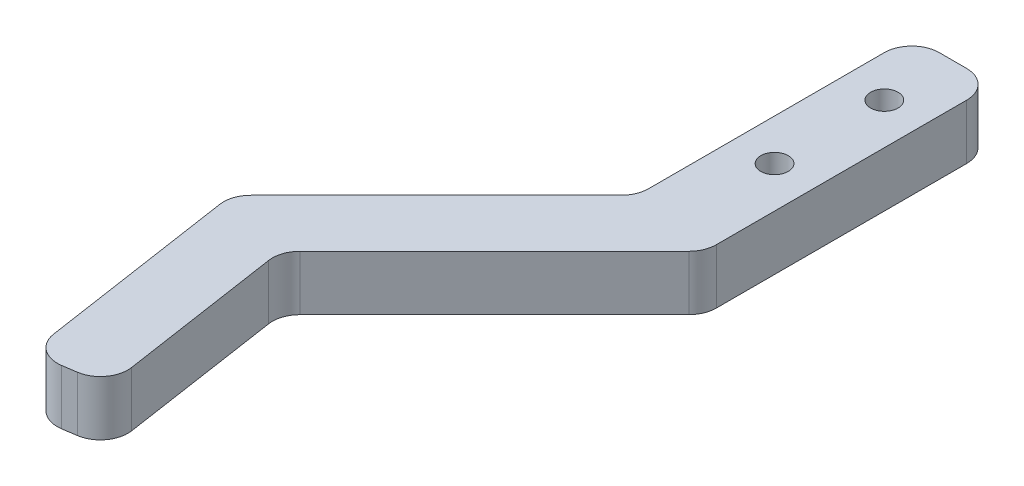
ISO-10303-21;
HEADER;
FILE_DESCRIPTION(('STEP AP214'),'2;1');
FILE_NAME('part.step','',(''),(''),'','','');
FILE_SCHEMA(('AUTOMOTIVE_DESIGN { 1 0 10303 214 1 1 1 1 }'));
ENDSEC;
DATA;
#1=APPLICATION_CONTEXT('core data for automotive mechanical design processes');
#2=APPLICATION_PROTOCOL_DEFINITION('international standard','automotive_design',2000,#1);
#3=PRODUCT_CONTEXT('',#1,'mechanical');
#4=PRODUCT('Part','Part','',(#3));
#5=PRODUCT_RELATED_PRODUCT_CATEGORY('part','',(#4));
#6=PRODUCT_DEFINITION_FORMATION('','',#4);
#7=PRODUCT_DEFINITION_CONTEXT('part definition',#1,'design');
#8=PRODUCT_DEFINITION('design','',#6,#7);
#9=PRODUCT_DEFINITION_SHAPE('','',#8);
#10=(LENGTH_UNIT() NAMED_UNIT(*) SI_UNIT(.MILLI.,.METRE.));
#11=(NAMED_UNIT(*) PLANE_ANGLE_UNIT() SI_UNIT($,.RADIAN.));
#12=(NAMED_UNIT(*) SI_UNIT($,.STERADIAN.) SOLID_ANGLE_UNIT());
#13=UNCERTAINTY_MEASURE_WITH_UNIT(LENGTH_MEASURE(1.E-05),#10,'distance_accuracy_value','');
#14=(GEOMETRIC_REPRESENTATION_CONTEXT(3) GLOBAL_UNCERTAINTY_ASSIGNED_CONTEXT((#13)) GLOBAL_UNIT_ASSIGNED_CONTEXT((#10,
#11,#12)) REPRESENTATION_CONTEXT('',''));
#15=CARTESIAN_POINT('',(0.,0.,0.));
#16=DIRECTION('',(0.,0.,1.));
#17=DIRECTION('',(1.,0.,0.));
#18=AXIS2_PLACEMENT_3D('',#15,#16,#17);
#19=CARTESIAN_POINT('',(-1.51540342298289,4.,-10.1026894865526));
#20=DIRECTION('',(0.148340452930245,0.,0.988936352868298));
#21=DIRECTION('',(0.988936352868298,0.,-0.148340452930245));
#22=AXIS2_PLACEMENT_3D('',#19,#20,#21);
#23=PLANE('',#22);
#24=DIRECTION('',(-0.988936352868298,0.,0.148340452930245));
#25=VECTOR('',#24,1.);
#26=CARTESIAN_POINT('',(-1.51540342298289,0.,-10.1026894865526));
#27=LINE('',#26,#25);
#28=CARTESIAN_POINT('',(20.7668090586049,0.,-13.4450213587907));
#29=VERTEX_POINT('',#28);
#30=CARTESIAN_POINT('',(19.7778727057366,0.,-13.2966809058605));
#31=VERTEX_POINT('',#30);
#32=EDGE_CURVE('E252',#29,#31,#27,.T.);
#33=ORIENTED_EDGE('',*,*,#32,.F.);
#34=DIRECTION('',(0.,-1.,0.));
#35=VECTOR('',#34,1.);
#36=CARTESIAN_POINT('',(20.7668090586049,4.,-13.4450213587907));
#37=LINE('',#36,#35);
#38=CARTESIAN_POINT('',(20.7668090586049,4.,-13.4450213587907));
#39=VERTEX_POINT('',#38);
#40=EDGE_CURVE('E230',#29,#39,#37,.F.);
#41=ORIENTED_EDGE('',*,*,#40,.T.);
#42=DIRECTION('',(-0.988936352868298,0.,0.148340452930245));
#43=VECTOR('',#42,1.);
#44=CARTESIAN_POINT('',(-1.51540342298289,4.,-10.1026894865526));
#45=LINE('',#44,#43);
#46=CARTESIAN_POINT('',(19.7778727057366,4.,-13.2966809058605));
#47=VERTEX_POINT('',#46);
#48=EDGE_CURVE('E270',#39,#47,#45,.T.);
#49=ORIENTED_EDGE('',*,*,#48,.T.);
#50=DIRECTION('',(0.,-1.,0.));
#51=VECTOR('',#50,1.);
#52=CARTESIAN_POINT('',(19.7778727057366,0.,-13.2966809058605));
#53=LINE('',#52,#51);
#54=EDGE_CURVE('E227',#47,#31,#53,.T.);
#55=ORIENTED_EDGE('',*,*,#54,.T.);
#56=EDGE_LOOP('',(#33,#41,#49,#55));
#57=FACE_BOUND('',#56,.T.);
#58=ADVANCED_FACE('F40',(#57),#23,.T.);
#59=CARTESIAN_POINT('',(24.2600851873244,4.,-3.63901277809867));
#60=DIRECTION('',(0.988936352868298,0.,-0.148340452930245));
#61=DIRECTION('',(-0.148340452930245,0.,-0.988936352868298));
#62=AXIS2_PLACEMENT_3D('',#59,#60,#61);
#63=PLANE('',#62);
#64=DIRECTION('',(0.148340452930245,0.,0.988936352868298));
#65=VECTOR('',#64,1.);
#66=CARTESIAN_POINT('',(24.2600851873244,4.,-3.63901277809867));
#67=LINE('',#66,#65);
#68=CARTESIAN_POINT('',(20.6858109343909,4.,-27.4675077976549));
#69=VERTEX_POINT('',#68);
#70=CARTESIAN_POINT('',(22.448000858481,4.,-15.7195749703878));
#71=VERTEX_POINT('',#70);
#72=EDGE_CURVE('E261',#69,#71,#67,.T.);
#73=ORIENTED_EDGE('',*,*,#72,.T.);
#74=DIRECTION('',(0.,-1.,0.));
#75=VECTOR('',#74,1.);
#76=CARTESIAN_POINT('',(22.448000858481,4.,-15.7195749703878));
#77=LINE('',#76,#75);
#78=CARTESIAN_POINT('',(22.448000858481,0.,-15.7195749703878));
#79=VERTEX_POINT('',#78);
#80=EDGE_CURVE('E224',#71,#79,#77,.T.);
#81=ORIENTED_EDGE('',*,*,#80,.T.);
#82=DIRECTION('',(0.148340452930245,0.,0.988936352868298));
#83=VECTOR('',#82,1.);
#84=CARTESIAN_POINT('',(24.2600851873244,0.,-3.63901277809867));
#85=LINE('',#84,#83);
#86=CARTESIAN_POINT('',(20.6858109343909,0.,-27.4675077976549));
#87=VERTEX_POINT('',#86);
#88=EDGE_CURVE('E241',#87,#79,#85,.T.);
#89=ORIENTED_EDGE('',*,*,#88,.F.);
#90=DIRECTION('',(0.,-1.,0.));
#91=VECTOR('',#90,1.);
#92=CARTESIAN_POINT('',(20.6858109343909,4.,-27.4675077976549));
#93=LINE('',#92,#91);
#94=EDGE_CURVE('E222',#87,#69,#93,.F.);
#95=ORIENTED_EDGE('',*,*,#94,.T.);
#96=EDGE_LOOP('',(#73,#81,#89,#95));
#97=FACE_BOUND('',#96,.T.);
#98=ADVANCED_FACE('F249',(#97),#63,.T.);
#99=CARTESIAN_POINT('',(-3.96446609406635,4.,-3.9644660940661));
#100=DIRECTION('',(0.70710678118657,0.,0.707106781186525));
#101=DIRECTION('',(0.707106781186525,0.,-0.70710678118657));
#102=AXIS2_PLACEMENT_3D('',#99,#100,#101);
#103=PLANE('',#102);
#104=DIRECTION('',(-0.707106781186525,0.,0.70710678118657));
#105=VECTOR('',#104,1.);
#106=CARTESIAN_POINT('',(-3.96446609406635,0.,-3.9644660940661));
#107=LINE('',#106,#105);
#108=CARTESIAN_POINT('',(35.4142135623728,0.,-43.3431457505078));
#109=VERTEX_POINT('',#108);
#110=CARTESIAN_POINT('',(21.2494700777544,0.,-29.1784022658884));
#111=VERTEX_POINT('',#110);
#112=EDGE_CURVE('E243',#109,#111,#107,.T.);
#113=ORIENTED_EDGE('',*,*,#112,.F.);
#114=DIRECTION('',(0.,-1.,0.));
#115=VECTOR('',#114,1.);
#116=CARTESIAN_POINT('',(35.4142135623728,4.,-43.3431457505078));
#117=LINE('',#116,#115);
#118=CARTESIAN_POINT('',(35.4142135623728,4.,-43.3431457505078));
#119=VERTEX_POINT('',#118);
#120=EDGE_CURVE('E204',#109,#119,#117,.F.);
#121=ORIENTED_EDGE('',*,*,#120,.T.);
#122=DIRECTION('',(-0.707106781186525,0.,0.70710678118657));
#123=VECTOR('',#122,1.);
#124=CARTESIAN_POINT('',(-3.96446609406635,4.,-3.9644660940661));
#125=LINE('',#124,#123);
#126=CARTESIAN_POINT('',(21.2494700777544,4.,-29.1784022658884));
#127=VERTEX_POINT('',#126);
#128=EDGE_CURVE('E259',#119,#127,#125,.T.);
#129=ORIENTED_EDGE('',*,*,#128,.T.);
#130=DIRECTION('',(0.,-1.,0.));
#131=VECTOR('',#130,1.);
#132=CARTESIAN_POINT('',(21.2494700777544,0.,-29.1784022658884));
#133=LINE('',#132,#131);
#134=EDGE_CURVE('E201',#127,#111,#133,.T.);
#135=ORIENTED_EDGE('',*,*,#134,.T.);
#136=EDGE_LOOP('',(#113,#121,#129,#135));
#137=FACE_BOUND('',#136,.T.);
#138=ADVANCED_FACE('F263',(#137),#103,.T.);
#139=CARTESIAN_POINT('',(35.9999999999987,4.,8.18003748609221E-13));
#140=DIRECTION('',(1.,0.,0.));
#141=DIRECTION('',(0.,0.,-1.));
#142=AXIS2_PLACEMENT_3D('',#139,#140,#141);
#143=PLANE('',#142);
#144=DIRECTION('',(0.,0.,1.));
#145=VECTOR('',#144,1.);
#146=CARTESIAN_POINT('',(35.9999999999987,4.,8.18003748609221E-13));
#147=LINE('',#146,#145);
#148=CARTESIAN_POINT('',(36.0000000000001,4.,-62.9999999999999));
#149=VERTEX_POINT('',#148);
#150=CARTESIAN_POINT('',(35.9999999999997,4.,-44.7573593128808));
#151=VERTEX_POINT('',#150);
#152=EDGE_CURVE('E265',#149,#151,#147,.T.);
#153=ORIENTED_EDGE('',*,*,#152,.T.);
#154=DIRECTION('',(0.,-1.,0.));
#155=VECTOR('',#154,1.);
#156=CARTESIAN_POINT('',(35.9999999999997,4.,-44.7573593128808));
#157=LINE('',#156,#155);
#158=CARTESIAN_POINT('',(35.9999999999997,0.,-44.7573593128808));
#159=VERTEX_POINT('',#158);
#160=EDGE_CURVE('E165',#151,#159,#157,.T.);
#161=ORIENTED_EDGE('',*,*,#160,.T.);
#162=DIRECTION('',(0.,0.,1.));
#163=VECTOR('',#162,1.);
#164=CARTESIAN_POINT('',(35.9999999999987,0.,8.18003748609221E-13));
#165=LINE('',#164,#163);
#166=CARTESIAN_POINT('',(36.0000000000001,0.,-62.9999999999999));
#167=VERTEX_POINT('',#166);
#168=EDGE_CURVE('E289',#167,#159,#165,.T.);
#169=ORIENTED_EDGE('',*,*,#168,.F.);
#170=DIRECTION('',(0.,-1.,0.));
#171=VECTOR('',#170,1.);
#172=CARTESIAN_POINT('',(36.0000000000001,4.,-62.9999999999999));
#173=LINE('',#172,#171);
#174=EDGE_CURVE('E188',#167,#149,#173,.F.);
#175=ORIENTED_EDGE('',*,*,#174,.T.);
#176=EDGE_LOOP('',(#153,#161,#169,#175));
#177=FACE_BOUND('',#176,.T.);
#178=ADVANCED_FACE('F320',(#177),#143,.T.);
#179=CARTESIAN_POINT('',(6.01370805005278E-13,4.,-65.0000000000003));
#180=DIRECTION('',(0.,0.,-1.));
#181=DIRECTION('',(-1.,0.,0.));
#182=AXIS2_PLACEMENT_3D('',#179,#180,#181);
#183=PLANE('',#182);
#184=DIRECTION('',(1.,0.,0.));
#185=VECTOR('',#184,1.);
#186=CARTESIAN_POINT('',(6.01370805005278E-13,4.,-65.0000000000003));
#187=LINE('',#186,#185);
#188=CARTESIAN_POINT('',(32.,4.,-65.));
#189=VERTEX_POINT('',#188);
#190=CARTESIAN_POINT('',(34.0000000000001,4.,-65.));
#191=VERTEX_POINT('',#190);
#192=EDGE_CURVE('E268',#189,#191,#187,.T.);
#193=ORIENTED_EDGE('',*,*,#192,.T.);
#194=DIRECTION('',(0.,-1.,0.));
#195=VECTOR('',#194,1.);
#196=CARTESIAN_POINT('',(34.0000000000001,4.,-65.));
#197=LINE('',#196,#195);
#198=CARTESIAN_POINT('',(34.0000000000001,0.,-65.));
#199=VERTEX_POINT('',#198);
#200=EDGE_CURVE('E219',#191,#199,#197,.T.);
#201=ORIENTED_EDGE('',*,*,#200,.T.);
#202=DIRECTION('',(1.,0.,0.));
#203=VECTOR('',#202,1.);
#204=CARTESIAN_POINT('',(6.01370805005278E-13,0.,-65.0000000000003));
#205=LINE('',#204,#203);
#206=CARTESIAN_POINT('',(32.,0.,-65.));
#207=VERTEX_POINT('',#206);
#208=EDGE_CURVE('E291',#207,#199,#205,.T.);
#209=ORIENTED_EDGE('',*,*,#208,.F.);
#210=DIRECTION('',(0.,-1.,0.));
#211=VECTOR('',#210,1.);
#212=CARTESIAN_POINT('',(32.,4.,-65.));
#213=LINE('',#212,#211);
#214=EDGE_CURVE('E217',#207,#189,#213,.F.);
#215=ORIENTED_EDGE('',*,*,#214,.T.);
#216=EDGE_LOOP('',(#193,#201,#209,#215));
#217=FACE_BOUND('',#216,.T.);
#218=ADVANCED_FACE('F311',(#217),#183,.T.);
#219=CARTESIAN_POINT('',(29.9999999999996,4.,1.92554305833423E-13));
#220=DIRECTION('',(-1.,0.,0.));
#221=DIRECTION('',(0.,0.,1.));
#222=AXIS2_PLACEMENT_3D('',#219,#220,#221);
#223=PLANE('',#222);
#224=DIRECTION('',(0.,0.,-1.));
#225=VECTOR('',#224,1.);
#226=CARTESIAN_POINT('',(29.9999999999996,0.,1.92554305833423E-13));
#227=LINE('',#226,#225);
#228=CARTESIAN_POINT('',(29.9999999999999,0.,-45.8284271247462));
#229=VERTEX_POINT('',#228);
#230=CARTESIAN_POINT('',(30.,0.,-63.));
#231=VERTEX_POINT('',#230);
#232=EDGE_CURVE('E174',#229,#231,#227,.T.);
#233=ORIENTED_EDGE('',*,*,#232,.F.);
#234=DIRECTION('',(0.,-1.,0.));
#235=VECTOR('',#234,1.);
#236=CARTESIAN_POINT('',(29.9999999999999,4.,-45.8284271247462));
#237=LINE('',#236,#235);
#238=CARTESIAN_POINT('',(29.9999999999999,4.,-45.8284271247462));
#239=VERTEX_POINT('',#238);
#240=EDGE_CURVE('E186',#229,#239,#237,.F.);
#241=ORIENTED_EDGE('',*,*,#240,.T.);
#242=DIRECTION('',(0.,0.,-1.));
#243=VECTOR('',#242,1.);
#244=CARTESIAN_POINT('',(29.9999999999996,4.,1.92554305833423E-13));
#245=LINE('',#244,#243);
#246=CARTESIAN_POINT('',(30.,4.,-63.));
#247=VERTEX_POINT('',#246);
#248=EDGE_CURVE('E276',#239,#247,#245,.T.);
#249=ORIENTED_EDGE('',*,*,#248,.T.);
#250=DIRECTION('',(0.,-1.,0.));
#251=VECTOR('',#250,1.);
#252=CARTESIAN_POINT('',(30.,4.,-63.));
#253=LINE('',#252,#251);
#254=EDGE_CURVE('E178',#247,#231,#253,.T.);
#255=ORIENTED_EDGE('',*,*,#254,.T.);
#256=EDGE_LOOP('',(#233,#241,#249,#255));
#257=FACE_BOUND('',#256,.T.);
#258=ADVANCED_FACE('F299',(#257),#223,.T.);
#259=CARTESIAN_POINT('',(-7.49999999999961,4.,-7.49999999999937));
#260=DIRECTION('',(-0.707106781186559,0.,-0.707106781186536));
#261=DIRECTION('',(-0.707106781186536,0.,0.707106781186559));
#262=AXIS2_PLACEMENT_3D('',#259,#260,#261);
#263=PLANE('',#262);
#264=DIRECTION('',(0.707106781186536,0.,-0.707106781186559));
#265=VECTOR('',#264,1.);
#266=CARTESIAN_POINT('',(-7.49999999999961,4.,-7.49999999999937));
#267=LINE('',#266,#265);
#268=CARTESIAN_POINT('',(15.9306898379118,4.,-30.9306898379115));
#269=VERTEX_POINT('',#268);
#270=CARTESIAN_POINT('',(29.414213562373,4.,-44.4142135623731));
#271=VERTEX_POINT('',#270);
#272=EDGE_CURVE('E180',#269,#271,#267,.T.);
#273=ORIENTED_EDGE('',*,*,#272,.T.);
#274=DIRECTION('',(0.,-1.,0.));
#275=VECTOR('',#274,1.);
#276=CARTESIAN_POINT('',(29.414213562373,0.,-44.4142135623731));
#277=LINE('',#276,#275);
#278=CARTESIAN_POINT('',(29.414213562373,0.,-44.4142135623731));
#279=VERTEX_POINT('',#278);
#280=EDGE_CURVE('E173',#271,#279,#277,.T.);
#281=ORIENTED_EDGE('',*,*,#280,.T.);
#282=DIRECTION('',(0.707106781186536,0.,-0.707106781186559));
#283=VECTOR('',#282,1.);
#284=CARTESIAN_POINT('',(-7.49999999999961,0.,-7.49999999999937));
#285=LINE('',#284,#283);
#286=CARTESIAN_POINT('',(15.9306898379118,0.,-30.9306898379115));
#287=VERTEX_POINT('',#286);
#288=EDGE_CURVE('E158',#287,#279,#285,.T.);
#289=ORIENTED_EDGE('',*,*,#288,.F.);
#290=DIRECTION('',(0.,-1.,0.));
#291=VECTOR('',#290,1.);
#292=CARTESIAN_POINT('',(15.9306898379118,4.,-30.9306898379115));
#293=LINE('',#292,#291);
#294=EDGE_CURVE('E171',#287,#269,#293,.F.);
#295=ORIENTED_EDGE('',*,*,#294,.T.);
#296=EDGE_LOOP('',(#273,#281,#289,#295));
#297=FACE_BOUND('',#296,.T.);
#298=ADVANCED_FACE('F170',(#297),#263,.T.);
#299=CARTESIAN_POINT('',(32.9999999999999,4.,-60.));
#300=DIRECTION('',(0.,-1.,0.));
#301=DIRECTION('',(0.,0.,-1.));
#302=AXIS2_PLACEMENT_3D('',#299,#300,#301);
#303=CYLINDRICAL_SURFACE('',#302,1.00000000000016);
#304=CARTESIAN_POINT('',(32.9999999999999,4.,-60.));
#305=DIRECTION('',(0.,1.,0.));
#306=DIRECTION('',(0.,0.,1.));
#307=AXIS2_PLACEMENT_3D('',#304,#305,#306);
#308=CIRCLE('',#307,1.00000000000016);
#309=CARTESIAN_POINT('',(32.9999999999999,4.,-58.9999999999998));
#310=VERTEX_POINT('',#309);
#311=EDGE_CURVE('E554',#310,#310,#308,.T.);
#312=ORIENTED_EDGE('',*,*,#311,.T.);
#313=EDGE_LOOP('',(#312));
#314=FACE_BOUND('',#313,.T.);
#315=CARTESIAN_POINT('',(32.9999999999999,0.,-60.));
#316=DIRECTION('',(0.,1.,0.));
#317=DIRECTION('',(0.,0.,1.));
#318=AXIS2_PLACEMENT_3D('',#315,#316,#317);
#319=CIRCLE('',#318,1.00000000000016);
#320=CARTESIAN_POINT('',(32.9999999999999,0.,-58.9999999999998));
#321=VERTEX_POINT('',#320);
#322=EDGE_CURVE('E283',#321,#321,#319,.T.);
#323=ORIENTED_EDGE('',*,*,#322,.F.);
#324=EDGE_LOOP('',(#323));
#325=FACE_BOUND('',#324,.T.);
#326=ADVANCED_FACE('F342',(#314,#325),#303,.F.);
#327=CARTESIAN_POINT('',(32.9999999999999,4.,-52.));
#328=DIRECTION('',(0.,-1.,0.));
#329=DIRECTION('',(0.,0.,-1.));
#330=AXIS2_PLACEMENT_3D('',#327,#328,#329);
#331=CYLINDRICAL_SURFACE('',#330,1.00000000000018);
#332=CARTESIAN_POINT('',(32.9999999999999,4.,-52.));
#333=DIRECTION('',(0.,1.,0.));
#334=DIRECTION('',(0.,0.,1.));
#335=AXIS2_PLACEMENT_3D('',#332,#333,#334);
#336=CIRCLE('',#335,1.00000000000018);
#337=CARTESIAN_POINT('',(32.9999999999999,4.,-50.9999999999998));
#338=VERTEX_POINT('',#337);
#339=EDGE_CURVE('E357',#338,#338,#336,.T.);
#340=ORIENTED_EDGE('',*,*,#339,.T.);
#341=EDGE_LOOP('',(#340));
#342=FACE_BOUND('',#341,.T.);
#343=CARTESIAN_POINT('',(32.9999999999999,0.,-52.));
#344=DIRECTION('',(0.,1.,0.));
#345=DIRECTION('',(0.,0.,1.));
#346=AXIS2_PLACEMENT_3D('',#343,#344,#345);
#347=CIRCLE('',#346,1.00000000000018);
#348=CARTESIAN_POINT('',(32.9999999999999,0.,-50.9999999999998));
#349=VERTEX_POINT('',#348);
#350=EDGE_CURVE('E280',#349,#349,#347,.T.);
#351=ORIENTED_EDGE('',*,*,#350,.F.);
#352=EDGE_LOOP('',(#351));
#353=FACE_BOUND('',#352,.T.);
#354=ADVANCED_FACE('F345',(#342,#353),#331,.F.);
#355=CARTESIAN_POINT('',(19.3154034229829,4.,-2.89731051344745));
#356=DIRECTION('',(0.988936352868298,0.,-0.148340452930245));
#357=DIRECTION('',(-0.148340452930245,0.,-0.988936352868298));
#358=AXIS2_PLACEMENT_3D('',#355,#356,#357);
#359=PLANE('',#358);
#360=DIRECTION('',(0.148340452930245,0.,0.988936352868298));
#361=VECTOR('',#360,1.);
#362=CARTESIAN_POINT('',(19.3154034229829,0.,-2.89731051344745));
#363=LINE('',#362,#361);
#364=CARTESIAN_POINT('',(15.3670306945483,0.,-29.219795369678));
#365=VERTEX_POINT('',#364);
#366=CARTESIAN_POINT('',(17.5033190941395,0.,-14.9778727057366));
#367=VERTEX_POINT('',#366);
#368=EDGE_CURVE('E159',#365,#367,#363,.T.);
#369=ORIENTED_EDGE('',*,*,#368,.T.);
#370=DIRECTION('',(0.,-1.,0.));
#371=VECTOR('',#370,1.);
#372=CARTESIAN_POINT('',(17.5033190941395,4.,-14.9778727057366));
#373=LINE('',#372,#371);
#374=CARTESIAN_POINT('',(17.5033190941395,4.,-14.9778727057366));
#375=VERTEX_POINT('',#374);
#376=EDGE_CURVE('E55',#367,#375,#373,.F.);
#377=ORIENTED_EDGE('',*,*,#376,.T.);
#378=DIRECTION('',(0.148340452930245,0.,0.988936352868298));
#379=VECTOR('',#378,1.);
#380=CARTESIAN_POINT('',(19.3154034229829,4.,-2.89731051344745));
#381=LINE('',#380,#379);
#382=CARTESIAN_POINT('',(15.3670306945483,4.,-29.219795369678));
#383=VERTEX_POINT('',#382);
#384=EDGE_CURVE('E176',#383,#375,#381,.T.);
#385=ORIENTED_EDGE('',*,*,#384,.F.);
#386=DIRECTION('',(0.,-1.,0.));
#387=VECTOR('',#386,1.);
#388=CARTESIAN_POINT('',(15.3670306945483,0.,-29.2197953696779));
#389=LINE('',#388,#387);
#390=EDGE_CURVE('E232',#383,#365,#389,.T.);
#391=ORIENTED_EDGE('',*,*,#390,.T.);
#392=EDGE_LOOP('',(#369,#377,#385,#391));
#393=FACE_BOUND('',#392,.T.);
#394=ADVANCED_FACE('F348',(#393),#359,.F.);
#395=CARTESIAN_POINT('',(0.,4.,0.));
#396=DIRECTION('',(0.,1.,0.));
#397=DIRECTION('',(0.,0.,1.));
#398=AXIS2_PLACEMENT_3D('',#395,#396,#397);
#399=PLANE('',#398);
#400=ORIENTED_EDGE('',*,*,#339,.F.);
#401=EDGE_LOOP('',(#400));
#402=FACE_BOUND('',#401,.T.);
#403=ORIENTED_EDGE('',*,*,#311,.F.);
#404=EDGE_LOOP('',(#403));
#405=FACE_BOUND('',#404,.T.);
#406=ORIENTED_EDGE('',*,*,#128,.F.);
#407=CARTESIAN_POINT('',(33.9999999999997,4.,-44.7573593128808));
#408=DIRECTION('',(0.,1.,0.));
#409=DIRECTION('',(0.,0.,1.));
#410=AXIS2_PLACEMENT_3D('',#407,#408,#409);
#411=CIRCLE('',#410,2.);
#412=EDGE_CURVE('E215',#119,#151,#411,.T.);
#413=ORIENTED_EDGE('',*,*,#412,.T.);
#414=ORIENTED_EDGE('',*,*,#152,.F.);
#415=CARTESIAN_POINT('',(34.0000000000001,4.,-63.));
#416=DIRECTION('',(0.,1.,0.));
#417=DIRECTION('',(0.,0.,1.));
#418=AXIS2_PLACEMENT_3D('',#415,#416,#417);
#419=CIRCLE('',#418,2.);
#420=EDGE_CURVE('E213',#149,#191,#419,.T.);
#421=ORIENTED_EDGE('',*,*,#420,.T.);
#422=ORIENTED_EDGE('',*,*,#192,.F.);
#423=CARTESIAN_POINT('',(32.,4.,-63.));
#424=DIRECTION('',(0.,1.,0.));
#425=DIRECTION('',(0.,0.,1.));
#426=AXIS2_PLACEMENT_3D('',#423,#424,#425);
#427=CIRCLE('',#426,2.);
#428=EDGE_CURVE('E211',#189,#247,#427,.T.);
#429=ORIENTED_EDGE('',*,*,#428,.T.);
#430=ORIENTED_EDGE('',*,*,#248,.F.);
#431=CARTESIAN_POINT('',(27.9999999999998,4.,-45.8284271247462));
#432=DIRECTION('',(0.,1.,0.));
#433=DIRECTION('',(0.,0.,1.));
#434=AXIS2_PLACEMENT_3D('',#431,#432,#433);
#435=CIRCLE('',#434,2.);
#436=EDGE_CURVE('E237',#239,#271,#435,.F.);
#437=ORIENTED_EDGE('',*,*,#436,.T.);
#438=ORIENTED_EDGE('',*,*,#272,.F.);
#439=CARTESIAN_POINT('',(17.3449034002849,4.,-29.5164762755384));
#440=DIRECTION('',(0.,1.,0.));
#441=DIRECTION('',(0.,0.,1.));
#442=AXIS2_PLACEMENT_3D('',#439,#440,#441);
#443=CIRCLE('',#442,2.);
#444=EDGE_CURVE('E62',#269,#383,#443,.T.);
#445=ORIENTED_EDGE('',*,*,#444,.T.);
#446=ORIENTED_EDGE('',*,*,#384,.T.);
#447=CARTESIAN_POINT('',(19.4811917998761,4.,-15.2745536115971));
#448=DIRECTION('',(0.,1.,0.));
#449=DIRECTION('',(0.,0.,1.));
#450=AXIS2_PLACEMENT_3D('',#447,#448,#449);
#451=CIRCLE('',#450,2.);
#452=EDGE_CURVE('E207',#375,#47,#451,.T.);
#453=ORIENTED_EDGE('',*,*,#452,.T.);
#454=ORIENTED_EDGE('',*,*,#48,.F.);
#455=CARTESIAN_POINT('',(20.4701281527444,4.,-15.4228940645273));
#456=DIRECTION('',(0.,1.,0.));
#457=DIRECTION('',(0.,0.,1.));
#458=AXIS2_PLACEMENT_3D('',#455,#456,#457);
#459=CIRCLE('',#458,2.);
#460=EDGE_CURVE('E209',#39,#71,#459,.T.);
#461=ORIENTED_EDGE('',*,*,#460,.T.);
#462=ORIENTED_EDGE('',*,*,#72,.F.);
#463=CARTESIAN_POINT('',(22.6636836401275,4.,-27.7641887035154));
#464=DIRECTION('',(0.,1.,0.));
#465=DIRECTION('',(0.,0.,1.));
#466=AXIS2_PLACEMENT_3D('',#463,#464,#465);
#467=CIRCLE('',#466,2.);
#468=EDGE_CURVE('E11',#69,#127,#467,.F.);
#469=ORIENTED_EDGE('',*,*,#468,.T.);
#470=EDGE_LOOP('',(#406,#413,#414,#421,#422,#429,#430,#437,#438,#445,#446,#453,#454,#461,#462,#469));
#471=FACE_BOUND('',#470,.T.);
#472=ADVANCED_FACE('F258',(#402,#405,#471),#399,.T.);
#473=CARTESIAN_POINT('',(0.,0.,0.));
#474=DIRECTION('',(0.,1.,0.));
#475=DIRECTION('',(0.,0.,1.));
#476=AXIS2_PLACEMENT_3D('',#473,#474,#475);
#477=PLANE('',#476);
#478=ORIENTED_EDGE('',*,*,#350,.T.);
#479=EDGE_LOOP('',(#478));
#480=FACE_BOUND('',#479,.T.);
#481=ORIENTED_EDGE('',*,*,#322,.T.);
#482=EDGE_LOOP('',(#481));
#483=FACE_BOUND('',#482,.T.);
#484=ORIENTED_EDGE('',*,*,#168,.T.);
#485=CARTESIAN_POINT('',(33.9999999999997,0.,-44.7573593128808));
#486=DIRECTION('',(0.,1.,0.));
#487=DIRECTION('',(0.,0.,1.));
#488=AXIS2_PLACEMENT_3D('',#485,#486,#487);
#489=CIRCLE('',#488,2.);
#490=EDGE_CURVE('E199',#159,#109,#489,.F.);
#491=ORIENTED_EDGE('',*,*,#490,.T.);
#492=ORIENTED_EDGE('',*,*,#112,.T.);
#493=CARTESIAN_POINT('',(22.6636836401275,0.,-27.7641887035154));
#494=DIRECTION('',(0.,1.,0.));
#495=DIRECTION('',(0.,0.,1.));
#496=AXIS2_PLACEMENT_3D('',#493,#494,#495);
#497=CIRCLE('',#496,2.);
#498=EDGE_CURVE('E48',#111,#87,#497,.T.);
#499=ORIENTED_EDGE('',*,*,#498,.T.);
#500=ORIENTED_EDGE('',*,*,#88,.T.);
#501=CARTESIAN_POINT('',(20.4701281527444,0.,-15.4228940645273));
#502=DIRECTION('',(0.,1.,0.));
#503=DIRECTION('',(0.,0.,1.));
#504=AXIS2_PLACEMENT_3D('',#501,#502,#503);
#505=CIRCLE('',#504,2.);
#506=EDGE_CURVE('E193',#79,#29,#505,.F.);
#507=ORIENTED_EDGE('',*,*,#506,.T.);
#508=ORIENTED_EDGE('',*,*,#32,.T.);
#509=CARTESIAN_POINT('',(19.4811917998761,0.,-15.2745536115971));
#510=DIRECTION('',(0.,1.,0.));
#511=DIRECTION('',(0.,0.,1.));
#512=AXIS2_PLACEMENT_3D('',#509,#510,#511);
#513=CIRCLE('',#512,2.);
#514=EDGE_CURVE('E164',#31,#367,#513,.F.);
#515=ORIENTED_EDGE('',*,*,#514,.T.);
#516=ORIENTED_EDGE('',*,*,#368,.F.);
#517=CARTESIAN_POINT('',(17.3449034002849,0.,-29.5164762755384));
#518=DIRECTION('',(0.,1.,0.));
#519=DIRECTION('',(0.,0.,1.));
#520=AXIS2_PLACEMENT_3D('',#517,#518,#519);
#521=CIRCLE('',#520,2.);
#522=EDGE_CURVE('E154',#365,#287,#521,.F.);
#523=ORIENTED_EDGE('',*,*,#522,.T.);
#524=ORIENTED_EDGE('',*,*,#288,.T.);
#525=CARTESIAN_POINT('',(27.9999999999998,0.,-45.8284271247462));
#526=DIRECTION('',(0.,1.,0.));
#527=DIRECTION('',(0.,0.,1.));
#528=AXIS2_PLACEMENT_3D('',#525,#526,#527);
#529=CIRCLE('',#528,2.);
#530=EDGE_CURVE('E235',#279,#229,#529,.T.);
#531=ORIENTED_EDGE('',*,*,#530,.T.);
#532=ORIENTED_EDGE('',*,*,#232,.T.);
#533=CARTESIAN_POINT('',(32.,0.,-63.));
#534=DIRECTION('',(0.,1.,0.));
#535=DIRECTION('',(0.,0.,1.));
#536=AXIS2_PLACEMENT_3D('',#533,#534,#535);
#537=CIRCLE('',#536,2.);
#538=EDGE_CURVE('E195',#231,#207,#537,.F.);
#539=ORIENTED_EDGE('',*,*,#538,.T.);
#540=ORIENTED_EDGE('',*,*,#208,.T.);
#541=CARTESIAN_POINT('',(34.0000000000001,0.,-63.));
#542=DIRECTION('',(0.,1.,0.));
#543=DIRECTION('',(0.,0.,1.));
#544=AXIS2_PLACEMENT_3D('',#541,#542,#543);
#545=CIRCLE('',#544,2.);
#546=EDGE_CURVE('E197',#199,#167,#545,.F.);
#547=ORIENTED_EDGE('',*,*,#546,.T.);
#548=EDGE_LOOP('',(#484,#491,#492,#499,#500,#507,#508,#515,#516,#523,#524,#531,#532,#539,#540,#547));
#549=FACE_BOUND('',#548,.T.);
#550=ADVANCED_FACE('F157',(#480,#483,#549),#477,.F.);
#551=CARTESIAN_POINT('',(27.9999999999998,4.,-45.8284271247462));
#552=DIRECTION('',(0.,1.,0.));
#553=DIRECTION('',(0.,0.,1.));
#554=AXIS2_PLACEMENT_3D('',#551,#552,#553);
#555=CYLINDRICAL_SURFACE('',#554,2.);
#556=ORIENTED_EDGE('',*,*,#436,.F.);
#557=ORIENTED_EDGE('',*,*,#240,.F.);
#558=ORIENTED_EDGE('',*,*,#530,.F.);
#559=ORIENTED_EDGE('',*,*,#280,.F.);
#560=EDGE_LOOP('',(#556,#557,#558,#559));
#561=FACE_BOUND('',#560,.T.);
#562=ADVANCED_FACE('F304',(#561),#555,.F.);
#563=CARTESIAN_POINT('',(33.9999999999997,4.,-44.7573593128808));
#564=DIRECTION('',(0.,-1.,0.));
#565=DIRECTION('',(0.,0.,-1.));
#566=AXIS2_PLACEMENT_3D('',#563,#564,#565);
#567=CYLINDRICAL_SURFACE('',#566,2.);
#568=ORIENTED_EDGE('',*,*,#412,.F.);
#569=ORIENTED_EDGE('',*,*,#120,.F.);
#570=ORIENTED_EDGE('',*,*,#490,.F.);
#571=ORIENTED_EDGE('',*,*,#160,.F.);
#572=EDGE_LOOP('',(#568,#569,#570,#571));
#573=FACE_BOUND('',#572,.T.);
#574=ADVANCED_FACE('F323',(#573),#567,.T.);
#575=CARTESIAN_POINT('',(34.0000000000001,4.,-63.));
#576=DIRECTION('',(0.,-1.,0.));
#577=DIRECTION('',(0.,0.,-1.));
#578=AXIS2_PLACEMENT_3D('',#575,#576,#577);
#579=CYLINDRICAL_SURFACE('',#578,2.);
#580=ORIENTED_EDGE('',*,*,#420,.F.);
#581=ORIENTED_EDGE('',*,*,#174,.F.);
#582=ORIENTED_EDGE('',*,*,#546,.F.);
#583=ORIENTED_EDGE('',*,*,#200,.F.);
#584=EDGE_LOOP('',(#580,#581,#582,#583));
#585=FACE_BOUND('',#584,.T.);
#586=ADVANCED_FACE('F317',(#585),#579,.T.);
#587=CARTESIAN_POINT('',(32.,4.,-63.));
#588=DIRECTION('',(0.,-1.,0.));
#589=DIRECTION('',(0.,0.,-1.));
#590=AXIS2_PLACEMENT_3D('',#587,#588,#589);
#591=CYLINDRICAL_SURFACE('',#590,2.);
#592=ORIENTED_EDGE('',*,*,#428,.F.);
#593=ORIENTED_EDGE('',*,*,#214,.F.);
#594=ORIENTED_EDGE('',*,*,#538,.F.);
#595=ORIENTED_EDGE('',*,*,#254,.F.);
#596=EDGE_LOOP('',(#592,#593,#594,#595));
#597=FACE_BOUND('',#596,.T.);
#598=ADVANCED_FACE('F308',(#597),#591,.T.);
#599=CARTESIAN_POINT('',(20.4701281527444,4.,-15.4228940645273));
#600=DIRECTION('',(0.,-1.,0.));
#601=DIRECTION('',(0.,0.,-1.));
#602=AXIS2_PLACEMENT_3D('',#599,#600,#601);
#603=CYLINDRICAL_SURFACE('',#602,2.);
#604=ORIENTED_EDGE('',*,*,#460,.F.);
#605=ORIENTED_EDGE('',*,*,#40,.F.);
#606=ORIENTED_EDGE('',*,*,#506,.F.);
#607=ORIENTED_EDGE('',*,*,#80,.F.);
#608=EDGE_LOOP('',(#604,#605,#606,#607));
#609=FACE_BOUND('',#608,.T.);
#610=ADVANCED_FACE('F491',(#609),#603,.T.);
#611=CARTESIAN_POINT('',(19.4811917998761,4.,-15.2745536115971));
#612=DIRECTION('',(0.,1.,0.));
#613=DIRECTION('',(0.,0.,1.));
#614=AXIS2_PLACEMENT_3D('',#611,#612,#613);
#615=CYLINDRICAL_SURFACE('',#614,2.);
#616=ORIENTED_EDGE('',*,*,#452,.F.);
#617=ORIENTED_EDGE('',*,*,#376,.F.);
#618=ORIENTED_EDGE('',*,*,#514,.F.);
#619=ORIENTED_EDGE('',*,*,#54,.F.);
#620=EDGE_LOOP('',(#616,#617,#618,#619));
#621=FACE_BOUND('',#620,.T.);
#622=ADVANCED_FACE('F500',(#621),#615,.T.);
#623=CARTESIAN_POINT('',(22.6636836401275,4.,-27.7641887035154));
#624=DIRECTION('',(0.,1.,0.));
#625=DIRECTION('',(0.,0.,1.));
#626=AXIS2_PLACEMENT_3D('',#623,#624,#625);
#627=CYLINDRICAL_SURFACE('',#626,2.);
#628=ORIENTED_EDGE('',*,*,#468,.F.);
#629=ORIENTED_EDGE('',*,*,#94,.F.);
#630=ORIENTED_EDGE('',*,*,#498,.F.);
#631=ORIENTED_EDGE('',*,*,#134,.F.);
#632=EDGE_LOOP('',(#628,#629,#630,#631));
#633=FACE_BOUND('',#632,.T.);
#634=ADVANCED_FACE('F255',(#633),#627,.F.);
#635=CARTESIAN_POINT('',(17.3449034002849,4.,-29.5164762755384));
#636=DIRECTION('',(0.,1.,0.));
#637=DIRECTION('',(0.,0.,1.));
#638=AXIS2_PLACEMENT_3D('',#635,#636,#637);
#639=CYLINDRICAL_SURFACE('',#638,2.);
#640=ORIENTED_EDGE('',*,*,#444,.F.);
#641=ORIENTED_EDGE('',*,*,#294,.F.);
#642=ORIENTED_EDGE('',*,*,#522,.F.);
#643=ORIENTED_EDGE('',*,*,#390,.F.);
#644=EDGE_LOOP('',(#640,#641,#642,#643));
#645=FACE_BOUND('',#644,.T.);
#646=ADVANCED_FACE('F42',(#645),#639,.T.);
#647=CLOSED_SHELL('',(#58,#98,#138,#178,#218,#258,#298,#326,#354,#394,#472,#550,#562,#574,#586,
#598,#610,#622,#634,#646));
#648=MANIFOLD_SOLID_BREP('B2',#647);
#649=ADVANCED_BREP_SHAPE_REPRESENTATION('',(#18,#648),#14);
#650=SHAPE_DEFINITION_REPRESENTATION(#9,#649);
ENDSEC;
END-ISO-10303-21;
